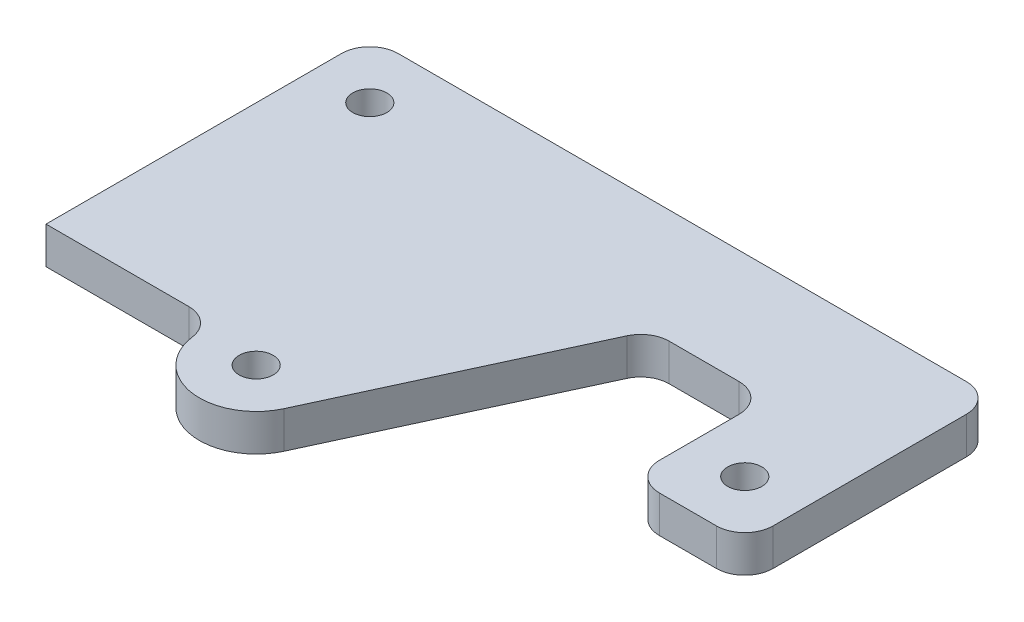
ISO-10303-21;
HEADER;
FILE_DESCRIPTION(('STEP AP214'),'2;1');
FILE_NAME('part.step','',(''),(''),'','','');
FILE_SCHEMA(('AUTOMOTIVE_DESIGN { 1 0 10303 214 1 1 1 1 }'));
ENDSEC;
DATA;
#1=APPLICATION_CONTEXT('core data for automotive mechanical design processes');
#2=APPLICATION_PROTOCOL_DEFINITION('international standard','automotive_design',2000,#1);
#3=PRODUCT_CONTEXT('',#1,'mechanical');
#4=PRODUCT('Part','Part','',(#3));
#5=PRODUCT_RELATED_PRODUCT_CATEGORY('part','',(#4));
#6=PRODUCT_DEFINITION_FORMATION('','',#4);
#7=PRODUCT_DEFINITION_CONTEXT('part definition',#1,'design');
#8=PRODUCT_DEFINITION('design','',#6,#7);
#9=PRODUCT_DEFINITION_SHAPE('','',#8);
#10=(LENGTH_UNIT() NAMED_UNIT(*) SI_UNIT(.MILLI.,.METRE.));
#11=(NAMED_UNIT(*) PLANE_ANGLE_UNIT() SI_UNIT($,.RADIAN.));
#12=(NAMED_UNIT(*) SI_UNIT($,.STERADIAN.) SOLID_ANGLE_UNIT());
#13=UNCERTAINTY_MEASURE_WITH_UNIT(LENGTH_MEASURE(1.E-05),#10,'distance_accuracy_value','');
#14=(GEOMETRIC_REPRESENTATION_CONTEXT(3) GLOBAL_UNCERTAINTY_ASSIGNED_CONTEXT((#13)) GLOBAL_UNIT_ASSIGNED_CONTEXT((#10,
#11,#12)) REPRESENTATION_CONTEXT('',''));
#15=CARTESIAN_POINT('',(0.,0.,0.));
#16=DIRECTION('',(0.,0.,1.));
#17=DIRECTION('',(1.,0.,0.));
#18=AXIS2_PLACEMENT_3D('',#15,#16,#17);
#19=CARTESIAN_POINT('',(25.1339312526815,6.5,5.));
#20=DIRECTION('',(0.,-1.,0.));
#21=DIRECTION('',(0.,0.,-1.));
#22=AXIS2_PLACEMENT_3D('',#19,#20,#21);
#23=PLANE('',#22);
#24=DIRECTION('',(1.,0.,0.));
#25=VECTOR('',#24,1.);
#26=CARTESIAN_POINT('',(0.,6.5,0.));
#27=LINE('',#26,#25);
#28=CARTESIAN_POINT('',(0.,6.5,0.));
#29=VERTEX_POINT('',#28);
#30=CARTESIAN_POINT('',(25.1339312526815,6.5,0.));
#31=VERTEX_POINT('',#30);
#32=EDGE_CURVE('E236',#29,#31,#27,.T.);
#33=ORIENTED_EDGE('',*,*,#32,.T.);
#34=CARTESIAN_POINT('',(25.1339312526815,6.5,5.));
#35=DIRECTION('',(0.,-1.,0.));
#36=DIRECTION('',(0.,0.,-1.));
#37=AXIS2_PLACEMENT_3D('',#34,#35,#36);
#38=CIRCLE('',#37,5.);
#39=CARTESIAN_POINT('',(30.0892875017877,6.5,4.33333333333333));
#40=VERTEX_POINT('',#39);
#41=EDGE_CURVE('E124',#31,#40,#38,.T.);
#42=ORIENTED_EDGE('',*,*,#41,.T.);
#43=CARTESIAN_POINT('',(40.,6.5,3.));
#44=DIRECTION('',(0.,1.,0.));
#45=DIRECTION('',(0.,0.,1.));
#46=AXIS2_PLACEMENT_3D('',#43,#44,#45);
#47=CIRCLE('',#46,10.);
#48=CARTESIAN_POINT('',(49.0779587270382,6.5,7.19412271520401));
#49=VERTEX_POINT('',#48);
#50=EDGE_CURVE('E289',#40,#49,#47,.T.);
#51=ORIENTED_EDGE('',*,*,#50,.T.);
#52=DIRECTION('',(0.419412271520401,0.,-0.907795872703824));
#53=VECTOR('',#52,1.);
#54=CARTESIAN_POINT('',(68.1549669251056,6.5,-34.097061357602));
#55=LINE('',#54,#53);
#56=CARTESIAN_POINT('',(68.1549669251056,6.5,-34.097061357602));
#57=VERTEX_POINT('',#56);
#58=EDGE_CURVE('E309',#49,#57,#55,.T.);
#59=ORIENTED_EDGE('',*,*,#58,.T.);
#60=CARTESIAN_POINT('',(72.6939462886247,6.5,-32.));
#61=DIRECTION('',(0.,-1.,0.));
#62=DIRECTION('',(0.,0.,1.));
#63=AXIS2_PLACEMENT_3D('',#60,#61,#62);
#64=CIRCLE('',#63,5.);
#65=CARTESIAN_POINT('',(72.6939462886247,6.5,-37.));
#66=VERTEX_POINT('',#65);
#67=EDGE_CURVE('E305',#57,#66,#64,.T.);
#68=ORIENTED_EDGE('',*,*,#67,.T.);
#69=DIRECTION('',(1.,0.,0.));
#70=VECTOR('',#69,1.);
#71=CARTESIAN_POINT('',(85.,6.5,-37.));
#72=LINE('',#71,#70);
#73=CARTESIAN_POINT('',(85.,6.5,-37.));
#74=VERTEX_POINT('',#73);
#75=EDGE_CURVE('E308',#66,#74,#72,.T.);
#76=ORIENTED_EDGE('',*,*,#75,.T.);
#77=CARTESIAN_POINT('',(85.,6.5,-32.));
#78=DIRECTION('',(0.,-1.,0.));
#79=DIRECTION('',(0.,0.,1.));
#80=AXIS2_PLACEMENT_3D('',#77,#78,#79);
#81=CIRCLE('',#80,5.);
#82=CARTESIAN_POINT('',(90.,6.5,-32.));
#83=VERTEX_POINT('',#82);
#84=EDGE_CURVE('E313',#74,#83,#81,.T.);
#85=ORIENTED_EDGE('',*,*,#84,.T.);
#86=DIRECTION('',(0.,0.,1.));
#87=VECTOR('',#86,1.);
#88=CARTESIAN_POINT('',(90.,6.5,-18.));
#89=LINE('',#88,#87);
#90=CARTESIAN_POINT('',(90.,6.5,-18.));
#91=VERTEX_POINT('',#90);
#92=EDGE_CURVE('E320',#83,#91,#89,.T.);
#93=ORIENTED_EDGE('',*,*,#92,.T.);
#94=CARTESIAN_POINT('',(95.,6.5,-18.));
#95=DIRECTION('',(0.,1.,0.));
#96=DIRECTION('',(0.,0.,-1.));
#97=AXIS2_PLACEMENT_3D('',#94,#95,#96);
#98=CIRCLE('',#97,5.);
#99=CARTESIAN_POINT('',(95.,6.5,-13.));
#100=VERTEX_POINT('',#99);
#101=EDGE_CURVE('E323',#91,#100,#98,.T.);
#102=ORIENTED_EDGE('',*,*,#101,.T.);
#103=DIRECTION('',(1.,0.,0.));
#104=VECTOR('',#103,1.);
#105=CARTESIAN_POINT('',(105.,6.5,-13.));
#106=LINE('',#105,#104);
#107=CARTESIAN_POINT('',(105.,6.5,-13.));
#108=VERTEX_POINT('',#107);
#109=EDGE_CURVE('E326',#100,#108,#106,.T.);
#110=ORIENTED_EDGE('',*,*,#109,.T.);
#111=CARTESIAN_POINT('',(105.,6.5,-18.));
#112=DIRECTION('',(0.,1.,0.));
#113=DIRECTION('',(0.,0.,-1.));
#114=AXIS2_PLACEMENT_3D('',#111,#112,#113);
#115=CIRCLE('',#114,5.);
#116=CARTESIAN_POINT('',(110.,6.5,-18.));
#117=VERTEX_POINT('',#116);
#118=EDGE_CURVE('E329',#108,#117,#115,.T.);
#119=ORIENTED_EDGE('',*,*,#118,.T.);
#120=DIRECTION('',(0.,0.,-1.));
#121=VECTOR('',#120,1.);
#122=CARTESIAN_POINT('',(110.,6.5,-52.));
#123=LINE('',#122,#121);
#124=CARTESIAN_POINT('',(110.,6.5,-52.));
#125=VERTEX_POINT('',#124);
#126=EDGE_CURVE('E332',#117,#125,#123,.T.);
#127=ORIENTED_EDGE('',*,*,#126,.T.);
#128=CARTESIAN_POINT('',(105.,6.5,-52.));
#129=DIRECTION('',(0.,1.,0.));
#130=DIRECTION('',(0.,0.,-1.));
#131=AXIS2_PLACEMENT_3D('',#128,#129,#130);
#132=CIRCLE('',#131,5.);
#133=CARTESIAN_POINT('',(105.,6.5,-57.));
#134=VERTEX_POINT('',#133);
#135=EDGE_CURVE('E167',#125,#134,#132,.T.);
#136=ORIENTED_EDGE('',*,*,#135,.T.);
#137=DIRECTION('',(-1.,0.,0.));
#138=VECTOR('',#137,1.);
#139=CARTESIAN_POINT('',(5.00000000000004,6.5,-57.));
#140=LINE('',#139,#138);
#141=CARTESIAN_POINT('',(5.,6.5,-57.));
#142=VERTEX_POINT('',#141);
#143=EDGE_CURVE('E161',#134,#142,#140,.T.);
#144=ORIENTED_EDGE('',*,*,#143,.T.);
#145=CARTESIAN_POINT('',(5.,6.5,-52.));
#146=DIRECTION('',(0.,1.,0.));
#147=DIRECTION('',(0.,0.,-1.));
#148=AXIS2_PLACEMENT_3D('',#145,#146,#147);
#149=CIRCLE('',#148,5.);
#150=CARTESIAN_POINT('',(0.,6.5,-52.));
#151=VERTEX_POINT('',#150);
#152=EDGE_CURVE('E165',#142,#151,#149,.T.);
#153=ORIENTED_EDGE('',*,*,#152,.T.);
#154=DIRECTION('',(0.,0.,1.));
#155=VECTOR('',#154,1.);
#156=CARTESIAN_POINT('',(0.,6.5,0.));
#157=LINE('',#156,#155);
#158=EDGE_CURVE('E57',#151,#29,#157,.T.);
#159=ORIENTED_EDGE('',*,*,#158,.T.);
#160=EDGE_LOOP('',(#33,#42,#51,#59,#68,#76,#85,#93,#102,#110,#119,#127,#136,#144,#153,#159));
#161=FACE_BOUND('',#160,.T.);
#162=CARTESIAN_POINT('',(10.,6.5,-47.));
#163=DIRECTION('',(0.,1.,0.));
#164=DIRECTION('',(0.,0.,1.));
#165=AXIS2_PLACEMENT_3D('',#162,#163,#164);
#166=CIRCLE('',#165,3.);
#167=CARTESIAN_POINT('',(10.,6.5,-50.));
#168=VERTEX_POINT('',#167);
#169=EDGE_CURVE('E194',#168,#168,#166,.T.);
#170=ORIENTED_EDGE('',*,*,#169,.F.);
#171=EDGE_LOOP('',(#170));
#172=FACE_BOUND('',#171,.T.);
#173=CARTESIAN_POINT('',(40.,6.5,3.));
#174=DIRECTION('',(0.,1.,0.));
#175=DIRECTION('',(0.,0.,1.));
#176=AXIS2_PLACEMENT_3D('',#173,#174,#175);
#177=CIRCLE('',#176,3.);
#178=CARTESIAN_POINT('',(40.,6.5,0.));
#179=VERTEX_POINT('',#178);
#180=EDGE_CURVE('E390',#179,#179,#177,.T.);
#181=ORIENTED_EDGE('',*,*,#180,.F.);
#182=EDGE_LOOP('',(#181));
#183=FACE_BOUND('',#182,.T.);
#184=CARTESIAN_POINT('',(100.,6.5,-23.));
#185=DIRECTION('',(0.,1.,0.));
#186=DIRECTION('',(0.,0.,1.));
#187=AXIS2_PLACEMENT_3D('',#184,#185,#186);
#188=CIRCLE('',#187,3.00000000000001);
#189=CARTESIAN_POINT('',(100.,6.5,-26.));
#190=VERTEX_POINT('',#189);
#191=EDGE_CURVE('E379',#190,#190,#188,.T.);
#192=ORIENTED_EDGE('',*,*,#191,.F.);
#193=EDGE_LOOP('',(#192));
#194=FACE_BOUND('',#193,.T.);
#195=ADVANCED_FACE('F39',(#161,#172,#183,#194),#23,.F.);
#196=CARTESIAN_POINT('',(25.1339312526815,0.,5.));
#197=DIRECTION('',(0.,-1.,0.));
#198=DIRECTION('',(0.,0.,-1.));
#199=AXIS2_PLACEMENT_3D('',#196,#197,#198);
#200=PLANE('',#199);
#201=CARTESIAN_POINT('',(40.,0.,3.));
#202=DIRECTION('',(0.,1.,0.));
#203=DIRECTION('',(0.,0.,1.));
#204=AXIS2_PLACEMENT_3D('',#201,#202,#203);
#205=CIRCLE('',#204,3.);
#206=CARTESIAN_POINT('',(40.,0.,0.));
#207=VERTEX_POINT('',#206);
#208=EDGE_CURVE('E387',#207,#207,#205,.T.);
#209=ORIENTED_EDGE('',*,*,#208,.T.);
#210=EDGE_LOOP('',(#209));
#211=FACE_BOUND('',#210,.T.);
#212=DIRECTION('',(1.,0.,0.));
#213=VECTOR('',#212,1.);
#214=CARTESIAN_POINT('',(0.,0.,0.));
#215=LINE('',#214,#213);
#216=CARTESIAN_POINT('',(0.,0.,0.));
#217=VERTEX_POINT('',#216);
#218=CARTESIAN_POINT('',(25.1339312526815,0.,0.));
#219=VERTEX_POINT('',#218);
#220=EDGE_CURVE('E189',#217,#219,#215,.T.);
#221=ORIENTED_EDGE('',*,*,#220,.F.);
#222=DIRECTION('',(0.,0.,1.));
#223=VECTOR('',#222,1.);
#224=CARTESIAN_POINT('',(0.,0.,0.));
#225=LINE('',#224,#223);
#226=CARTESIAN_POINT('',(0.,0.,-52.));
#227=VERTEX_POINT('',#226);
#228=EDGE_CURVE('E116',#227,#217,#225,.T.);
#229=ORIENTED_EDGE('',*,*,#228,.F.);
#230=CARTESIAN_POINT('',(5.,0.,-52.));
#231=DIRECTION('',(0.,1.,0.));
#232=DIRECTION('',(0.,0.,-1.));
#233=AXIS2_PLACEMENT_3D('',#230,#231,#232);
#234=CIRCLE('',#233,5.);
#235=CARTESIAN_POINT('',(5.,0.,-57.));
#236=VERTEX_POINT('',#235);
#237=EDGE_CURVE('E110',#236,#227,#234,.T.);
#238=ORIENTED_EDGE('',*,*,#237,.F.);
#239=DIRECTION('',(-1.,0.,0.));
#240=VECTOR('',#239,1.);
#241=CARTESIAN_POINT('',(5.00000000000004,0.,-57.));
#242=LINE('',#241,#240);
#243=CARTESIAN_POINT('',(105.,0.,-57.));
#244=VERTEX_POINT('',#243);
#245=EDGE_CURVE('E176',#244,#236,#242,.T.);
#246=ORIENTED_EDGE('',*,*,#245,.F.);
#247=CARTESIAN_POINT('',(105.,0.,-52.));
#248=DIRECTION('',(0.,1.,0.));
#249=DIRECTION('',(0.,0.,-1.));
#250=AXIS2_PLACEMENT_3D('',#247,#248,#249);
#251=CIRCLE('',#250,5.);
#252=CARTESIAN_POINT('',(110.,0.,-52.));
#253=VERTEX_POINT('',#252);
#254=EDGE_CURVE('E227',#253,#244,#251,.T.);
#255=ORIENTED_EDGE('',*,*,#254,.F.);
#256=DIRECTION('',(0.,0.,-1.));
#257=VECTOR('',#256,1.);
#258=CARTESIAN_POINT('',(110.,0.,-52.));
#259=LINE('',#258,#257);
#260=CARTESIAN_POINT('',(110.,0.,-18.));
#261=VERTEX_POINT('',#260);
#262=EDGE_CURVE('E224',#261,#253,#259,.T.);
#263=ORIENTED_EDGE('',*,*,#262,.F.);
#264=CARTESIAN_POINT('',(105.,0.,-18.));
#265=DIRECTION('',(0.,1.,0.));
#266=DIRECTION('',(0.,0.,-1.));
#267=AXIS2_PLACEMENT_3D('',#264,#265,#266);
#268=CIRCLE('',#267,5.);
#269=CARTESIAN_POINT('',(105.,0.,-13.));
#270=VERTEX_POINT('',#269);
#271=EDGE_CURVE('E221',#270,#261,#268,.T.);
#272=ORIENTED_EDGE('',*,*,#271,.F.);
#273=DIRECTION('',(1.,0.,0.));
#274=VECTOR('',#273,1.);
#275=CARTESIAN_POINT('',(105.,0.,-13.));
#276=LINE('',#275,#274);
#277=CARTESIAN_POINT('',(95.,0.,-13.));
#278=VERTEX_POINT('',#277);
#279=EDGE_CURVE('E218',#278,#270,#276,.T.);
#280=ORIENTED_EDGE('',*,*,#279,.F.);
#281=CARTESIAN_POINT('',(95.,0.,-18.));
#282=DIRECTION('',(0.,1.,0.));
#283=DIRECTION('',(0.,0.,-1.));
#284=AXIS2_PLACEMENT_3D('',#281,#282,#283);
#285=CIRCLE('',#284,5.);
#286=CARTESIAN_POINT('',(90.,0.,-18.));
#287=VERTEX_POINT('',#286);
#288=EDGE_CURVE('E215',#287,#278,#285,.T.);
#289=ORIENTED_EDGE('',*,*,#288,.F.);
#290=DIRECTION('',(0.,0.,1.));
#291=VECTOR('',#290,1.);
#292=CARTESIAN_POINT('',(90.,0.,-18.));
#293=LINE('',#292,#291);
#294=CARTESIAN_POINT('',(90.,0.,-32.));
#295=VERTEX_POINT('',#294);
#296=EDGE_CURVE('E212',#295,#287,#293,.T.);
#297=ORIENTED_EDGE('',*,*,#296,.F.);
#298=CARTESIAN_POINT('',(85.,0.,-32.));
#299=DIRECTION('',(0.,-1.,0.));
#300=DIRECTION('',(0.,0.,1.));
#301=AXIS2_PLACEMENT_3D('',#298,#299,#300);
#302=CIRCLE('',#301,5.);
#303=CARTESIAN_POINT('',(85.,0.,-37.));
#304=VERTEX_POINT('',#303);
#305=EDGE_CURVE('E209',#304,#295,#302,.T.);
#306=ORIENTED_EDGE('',*,*,#305,.F.);
#307=DIRECTION('',(1.,0.,0.));
#308=VECTOR('',#307,1.);
#309=CARTESIAN_POINT('',(85.,0.,-37.));
#310=LINE('',#309,#308);
#311=CARTESIAN_POINT('',(72.6939462886247,0.,-37.));
#312=VERTEX_POINT('',#311);
#313=EDGE_CURVE('E206',#312,#304,#310,.T.);
#314=ORIENTED_EDGE('',*,*,#313,.F.);
#315=CARTESIAN_POINT('',(72.6939462886247,0.,-32.));
#316=DIRECTION('',(0.,-1.,0.));
#317=DIRECTION('',(0.,0.,1.));
#318=AXIS2_PLACEMENT_3D('',#315,#316,#317);
#319=CIRCLE('',#318,5.);
#320=CARTESIAN_POINT('',(68.1549669251056,0.,-34.097061357602));
#321=VERTEX_POINT('',#320);
#322=EDGE_CURVE('E203',#321,#312,#319,.T.);
#323=ORIENTED_EDGE('',*,*,#322,.F.);
#324=DIRECTION('',(0.419412271520401,0.,-0.907795872703824));
#325=VECTOR('',#324,1.);
#326=CARTESIAN_POINT('',(68.1549669251056,0.,-34.097061357602));
#327=LINE('',#326,#325);
#328=CARTESIAN_POINT('',(49.0779587270382,0.,7.19412271520401));
#329=VERTEX_POINT('',#328);
#330=EDGE_CURVE('E200',#329,#321,#327,.T.);
#331=ORIENTED_EDGE('',*,*,#330,.F.);
#332=CARTESIAN_POINT('',(40.,0.,3.));
#333=DIRECTION('',(0.,1.,0.));
#334=DIRECTION('',(0.,0.,1.));
#335=AXIS2_PLACEMENT_3D('',#332,#333,#334);
#336=CIRCLE('',#335,10.);
#337=CARTESIAN_POINT('',(30.0892875017877,0.,4.33333333333333));
#338=VERTEX_POINT('',#337);
#339=EDGE_CURVE('E197',#338,#329,#336,.T.);
#340=ORIENTED_EDGE('',*,*,#339,.F.);
#341=CARTESIAN_POINT('',(25.1339312526815,0.,5.));
#342=DIRECTION('',(0.,-1.,0.));
#343=DIRECTION('',(0.,0.,-1.));
#344=AXIS2_PLACEMENT_3D('',#341,#342,#343);
#345=CIRCLE('',#344,5.);
#346=EDGE_CURVE('E193',#219,#338,#345,.T.);
#347=ORIENTED_EDGE('',*,*,#346,.F.);
#348=EDGE_LOOP('',(#221,#229,#238,#246,#255,#263,#272,#280,#289,#297,#306,#314,#323,#331,#340,#347));
#349=FACE_BOUND('',#348,.T.);
#350=CARTESIAN_POINT('',(10.,0.,-47.));
#351=DIRECTION('',(0.,1.,0.));
#352=DIRECTION('',(0.,0.,1.));
#353=AXIS2_PLACEMENT_3D('',#350,#351,#352);
#354=CIRCLE('',#353,3.);
#355=CARTESIAN_POINT('',(10.,0.,-50.));
#356=VERTEX_POINT('',#355);
#357=EDGE_CURVE('E394',#356,#356,#354,.T.);
#358=ORIENTED_EDGE('',*,*,#357,.T.);
#359=EDGE_LOOP('',(#358));
#360=FACE_BOUND('',#359,.T.);
#361=CARTESIAN_POINT('',(100.,0.,-23.));
#362=DIRECTION('',(0.,1.,0.));
#363=DIRECTION('',(0.,0.,1.));
#364=AXIS2_PLACEMENT_3D('',#361,#362,#363);
#365=CIRCLE('',#364,3.00000000000001);
#366=CARTESIAN_POINT('',(100.,0.,-26.));
#367=VERTEX_POINT('',#366);
#368=EDGE_CURVE('E382',#367,#367,#365,.T.);
#369=ORIENTED_EDGE('',*,*,#368,.T.);
#370=EDGE_LOOP('',(#369));
#371=FACE_BOUND('',#370,.T.);
#372=ADVANCED_FACE('F293',(#211,#349,#360,#371),#200,.T.);
#373=CARTESIAN_POINT('',(0.,6.5,0.));
#374=DIRECTION('',(0.,0.,-1.));
#375=DIRECTION('',(-1.,0.,0.));
#376=AXIS2_PLACEMENT_3D('',#373,#374,#375);
#377=PLANE('',#376);
#378=ORIENTED_EDGE('',*,*,#220,.T.);
#379=DIRECTION('',(0.,-1.,0.));
#380=VECTOR('',#379,1.);
#381=CARTESIAN_POINT('',(25.1339312526815,6.5,0.));
#382=LINE('',#381,#380);
#383=EDGE_CURVE('E11',#31,#219,#382,.T.);
#384=ORIENTED_EDGE('',*,*,#383,.F.);
#385=ORIENTED_EDGE('',*,*,#32,.F.);
#386=DIRECTION('',(0.,-1.,0.));
#387=VECTOR('',#386,1.);
#388=CARTESIAN_POINT('',(0.,6.5,0.));
#389=LINE('',#388,#387);
#390=EDGE_CURVE('E185',#29,#217,#389,.T.);
#391=ORIENTED_EDGE('',*,*,#390,.T.);
#392=EDGE_LOOP('',(#378,#384,#385,#391));
#393=FACE_BOUND('',#392,.T.);
#394=ADVANCED_FACE('F41',(#393),#377,.F.);
#395=CARTESIAN_POINT('',(25.1339312526815,6.5,5.));
#396=DIRECTION('',(0.,-1.,0.));
#397=DIRECTION('',(0.,0.,-1.));
#398=AXIS2_PLACEMENT_3D('',#395,#396,#397);
#399=CYLINDRICAL_SURFACE('',#398,5.);
#400=ORIENTED_EDGE('',*,*,#346,.T.);
#401=DIRECTION('',(0.,-1.,0.));
#402=VECTOR('',#401,1.);
#403=CARTESIAN_POINT('',(30.0892875017877,6.5,4.33333333333333));
#404=LINE('',#403,#402);
#405=EDGE_CURVE('E49',#40,#338,#404,.T.);
#406=ORIENTED_EDGE('',*,*,#405,.F.);
#407=ORIENTED_EDGE('',*,*,#41,.F.);
#408=ORIENTED_EDGE('',*,*,#383,.T.);
#409=EDGE_LOOP('',(#400,#406,#407,#408));
#410=FACE_BOUND('',#409,.T.);
#411=ADVANCED_FACE('F543',(#410),#399,.F.);
#412=CARTESIAN_POINT('',(40.,6.5,3.));
#413=DIRECTION('',(0.,-1.,0.));
#414=DIRECTION('',(0.,0.,-1.));
#415=AXIS2_PLACEMENT_3D('',#412,#413,#414);
#416=CYLINDRICAL_SURFACE('',#415,10.);
#417=ORIENTED_EDGE('',*,*,#339,.T.);
#418=DIRECTION('',(0.,-1.,0.));
#419=VECTOR('',#418,1.);
#420=CARTESIAN_POINT('',(49.0779587270382,6.5,7.19412271520401));
#421=LINE('',#420,#419);
#422=EDGE_CURVE('E279',#49,#329,#421,.T.);
#423=ORIENTED_EDGE('',*,*,#422,.F.);
#424=ORIENTED_EDGE('',*,*,#50,.F.);
#425=ORIENTED_EDGE('',*,*,#405,.T.);
#426=EDGE_LOOP('',(#417,#423,#424,#425));
#427=FACE_BOUND('',#426,.T.);
#428=ADVANCED_FACE('F287',(#427),#416,.T.);
#429=CARTESIAN_POINT('',(68.1549669251056,6.5,-34.097061357602));
#430=DIRECTION('',(-0.907795872703824,0.,-0.419412271520401));
#431=DIRECTION('',(-0.419412271520401,0.,0.907795872703824));
#432=AXIS2_PLACEMENT_3D('',#429,#430,#431);
#433=PLANE('',#432);
#434=ORIENTED_EDGE('',*,*,#330,.T.);
#435=DIRECTION('',(0.,-1.,0.));
#436=VECTOR('',#435,1.);
#437=CARTESIAN_POINT('',(68.1549669251056,6.5,-34.097061357602));
#438=LINE('',#437,#436);
#439=EDGE_CURVE('E275',#57,#321,#438,.T.);
#440=ORIENTED_EDGE('',*,*,#439,.F.);
#441=ORIENTED_EDGE('',*,*,#58,.F.);
#442=ORIENTED_EDGE('',*,*,#422,.T.);
#443=EDGE_LOOP('',(#434,#440,#441,#442));
#444=FACE_BOUND('',#443,.T.);
#445=ADVANCED_FACE('F299',(#444),#433,.F.);
#446=CARTESIAN_POINT('',(72.6939462886247,6.5,-32.));
#447=DIRECTION('',(0.,-1.,0.));
#448=DIRECTION('',(0.,0.,-1.));
#449=AXIS2_PLACEMENT_3D('',#446,#447,#448);
#450=CYLINDRICAL_SURFACE('',#449,5.);
#451=ORIENTED_EDGE('',*,*,#322,.T.);
#452=DIRECTION('',(0.,-1.,0.));
#453=VECTOR('',#452,1.);
#454=CARTESIAN_POINT('',(72.6939462886247,6.5,-37.));
#455=LINE('',#454,#453);
#456=EDGE_CURVE('E271',#66,#312,#455,.T.);
#457=ORIENTED_EDGE('',*,*,#456,.F.);
#458=ORIENTED_EDGE('',*,*,#67,.F.);
#459=ORIENTED_EDGE('',*,*,#439,.T.);
#460=EDGE_LOOP('',(#451,#457,#458,#459));
#461=FACE_BOUND('',#460,.T.);
#462=ADVANCED_FACE('F303',(#461),#450,.F.);
#463=CARTESIAN_POINT('',(85.,6.5,-37.));
#464=DIRECTION('',(0.,0.,-1.));
#465=DIRECTION('',(-1.,0.,0.));
#466=AXIS2_PLACEMENT_3D('',#463,#464,#465);
#467=PLANE('',#466);
#468=ORIENTED_EDGE('',*,*,#313,.T.);
#469=DIRECTION('',(0.,-1.,0.));
#470=VECTOR('',#469,1.);
#471=CARTESIAN_POINT('',(85.,6.5,-37.));
#472=LINE('',#471,#470);
#473=EDGE_CURVE('E267',#74,#304,#472,.T.);
#474=ORIENTED_EDGE('',*,*,#473,.F.);
#475=ORIENTED_EDGE('',*,*,#75,.F.);
#476=ORIENTED_EDGE('',*,*,#456,.T.);
#477=EDGE_LOOP('',(#468,#474,#475,#476));
#478=FACE_BOUND('',#477,.T.);
#479=ADVANCED_FACE('F508',(#478),#467,.F.);
#480=CARTESIAN_POINT('',(85.,6.5,-32.));
#481=DIRECTION('',(0.,-1.,0.));
#482=DIRECTION('',(0.,0.,-1.));
#483=AXIS2_PLACEMENT_3D('',#480,#481,#482);
#484=CYLINDRICAL_SURFACE('',#483,5.);
#485=ORIENTED_EDGE('',*,*,#305,.T.);
#486=DIRECTION('',(0.,-1.,0.));
#487=VECTOR('',#486,1.);
#488=CARTESIAN_POINT('',(90.,6.5,-32.));
#489=LINE('',#488,#487);
#490=EDGE_CURVE('E263',#83,#295,#489,.T.);
#491=ORIENTED_EDGE('',*,*,#490,.F.);
#492=ORIENTED_EDGE('',*,*,#84,.F.);
#493=ORIENTED_EDGE('',*,*,#473,.T.);
#494=EDGE_LOOP('',(#485,#491,#492,#493));
#495=FACE_BOUND('',#494,.T.);
#496=ADVANCED_FACE('F498',(#495),#484,.F.);
#497=CARTESIAN_POINT('',(90.,6.5,-18.));
#498=DIRECTION('',(1.,0.,0.));
#499=DIRECTION('',(0.,0.,-1.));
#500=AXIS2_PLACEMENT_3D('',#497,#498,#499);
#501=PLANE('',#500);
#502=ORIENTED_EDGE('',*,*,#296,.T.);
#503=DIRECTION('',(0.,-1.,0.));
#504=VECTOR('',#503,1.);
#505=CARTESIAN_POINT('',(90.,6.5,-18.));
#506=LINE('',#505,#504);
#507=EDGE_CURVE('E259',#91,#287,#506,.T.);
#508=ORIENTED_EDGE('',*,*,#507,.F.);
#509=ORIENTED_EDGE('',*,*,#92,.F.);
#510=ORIENTED_EDGE('',*,*,#490,.T.);
#511=EDGE_LOOP('',(#502,#508,#509,#510));
#512=FACE_BOUND('',#511,.T.);
#513=ADVANCED_FACE('F488',(#512),#501,.F.);
#514=CARTESIAN_POINT('',(95.,6.5,-18.));
#515=DIRECTION('',(0.,-1.,0.));
#516=DIRECTION('',(0.,0.,-1.));
#517=AXIS2_PLACEMENT_3D('',#514,#515,#516);
#518=CYLINDRICAL_SURFACE('',#517,5.);
#519=ORIENTED_EDGE('',*,*,#288,.T.);
#520=DIRECTION('',(0.,-1.,0.));
#521=VECTOR('',#520,1.);
#522=CARTESIAN_POINT('',(95.,6.5,-13.));
#523=LINE('',#522,#521);
#524=EDGE_CURVE('E255',#100,#278,#523,.T.);
#525=ORIENTED_EDGE('',*,*,#524,.F.);
#526=ORIENTED_EDGE('',*,*,#101,.F.);
#527=ORIENTED_EDGE('',*,*,#507,.T.);
#528=EDGE_LOOP('',(#519,#525,#526,#527));
#529=FACE_BOUND('',#528,.T.);
#530=ADVANCED_FACE('F478',(#529),#518,.T.);
#531=CARTESIAN_POINT('',(105.,6.5,-13.));
#532=DIRECTION('',(0.,0.,-1.));
#533=DIRECTION('',(-1.,0.,0.));
#534=AXIS2_PLACEMENT_3D('',#531,#532,#533);
#535=PLANE('',#534);
#536=ORIENTED_EDGE('',*,*,#279,.T.);
#537=DIRECTION('',(0.,-1.,0.));
#538=VECTOR('',#537,1.);
#539=CARTESIAN_POINT('',(105.,6.5,-13.));
#540=LINE('',#539,#538);
#541=EDGE_CURVE('E251',#108,#270,#540,.T.);
#542=ORIENTED_EDGE('',*,*,#541,.F.);
#543=ORIENTED_EDGE('',*,*,#109,.F.);
#544=ORIENTED_EDGE('',*,*,#524,.T.);
#545=EDGE_LOOP('',(#536,#542,#543,#544));
#546=FACE_BOUND('',#545,.T.);
#547=ADVANCED_FACE('F468',(#546),#535,.F.);
#548=CARTESIAN_POINT('',(105.,6.5,-18.));
#549=DIRECTION('',(0.,-1.,0.));
#550=DIRECTION('',(0.,0.,-1.));
#551=AXIS2_PLACEMENT_3D('',#548,#549,#550);
#552=CYLINDRICAL_SURFACE('',#551,5.);
#553=ORIENTED_EDGE('',*,*,#271,.T.);
#554=DIRECTION('',(0.,-1.,0.));
#555=VECTOR('',#554,1.);
#556=CARTESIAN_POINT('',(110.,6.5,-18.));
#557=LINE('',#556,#555);
#558=EDGE_CURVE('E247',#117,#261,#557,.T.);
#559=ORIENTED_EDGE('',*,*,#558,.F.);
#560=ORIENTED_EDGE('',*,*,#118,.F.);
#561=ORIENTED_EDGE('',*,*,#541,.T.);
#562=EDGE_LOOP('',(#553,#559,#560,#561));
#563=FACE_BOUND('',#562,.T.);
#564=ADVANCED_FACE('F459',(#563),#552,.T.);
#565=CARTESIAN_POINT('',(110.,6.5,-52.));
#566=DIRECTION('',(-1.,0.,0.));
#567=DIRECTION('',(0.,0.,1.));
#568=AXIS2_PLACEMENT_3D('',#565,#566,#567);
#569=PLANE('',#568);
#570=ORIENTED_EDGE('',*,*,#262,.T.);
#571=DIRECTION('',(0.,-1.,0.));
#572=VECTOR('',#571,1.);
#573=CARTESIAN_POINT('',(110.,6.5,-52.));
#574=LINE('',#573,#572);
#575=EDGE_CURVE('E243',#125,#253,#574,.T.);
#576=ORIENTED_EDGE('',*,*,#575,.F.);
#577=ORIENTED_EDGE('',*,*,#126,.F.);
#578=ORIENTED_EDGE('',*,*,#558,.T.);
#579=EDGE_LOOP('',(#570,#576,#577,#578));
#580=FACE_BOUND('',#579,.T.);
#581=ADVANCED_FACE('F340',(#580),#569,.F.);
#582=CARTESIAN_POINT('',(105.,6.5,-52.));
#583=DIRECTION('',(0.,-1.,0.));
#584=DIRECTION('',(0.,0.,-1.));
#585=AXIS2_PLACEMENT_3D('',#582,#583,#584);
#586=CYLINDRICAL_SURFACE('',#585,5.);
#587=ORIENTED_EDGE('',*,*,#254,.T.);
#588=DIRECTION('',(0.,-1.,0.));
#589=VECTOR('',#588,1.);
#590=CARTESIAN_POINT('',(105.,6.5,-57.));
#591=LINE('',#590,#589);
#592=EDGE_CURVE('E178',#134,#244,#591,.T.);
#593=ORIENTED_EDGE('',*,*,#592,.F.);
#594=ORIENTED_EDGE('',*,*,#135,.F.);
#595=ORIENTED_EDGE('',*,*,#575,.T.);
#596=EDGE_LOOP('',(#587,#593,#594,#595));
#597=FACE_BOUND('',#596,.T.);
#598=ADVANCED_FACE('F344',(#597),#586,.T.);
#599=CARTESIAN_POINT('',(5.00000000000004,6.5,-57.));
#600=DIRECTION('',(0.,0.,1.));
#601=DIRECTION('',(1.,0.,0.));
#602=AXIS2_PLACEMENT_3D('',#599,#600,#601);
#603=PLANE('',#602);
#604=ORIENTED_EDGE('',*,*,#245,.T.);
#605=DIRECTION('',(0.,-1.,0.));
#606=VECTOR('',#605,1.);
#607=CARTESIAN_POINT('',(5.,6.5,-57.));
#608=LINE('',#607,#606);
#609=EDGE_CURVE('E173',#142,#236,#608,.T.);
#610=ORIENTED_EDGE('',*,*,#609,.F.);
#611=ORIENTED_EDGE('',*,*,#143,.F.);
#612=ORIENTED_EDGE('',*,*,#592,.T.);
#613=EDGE_LOOP('',(#604,#610,#611,#612));
#614=FACE_BOUND('',#613,.T.);
#615=ADVANCED_FACE('F174',(#614),#603,.F.);
#616=CARTESIAN_POINT('',(5.,6.5,-52.));
#617=DIRECTION('',(0.,-1.,0.));
#618=DIRECTION('',(0.,0.,-1.));
#619=AXIS2_PLACEMENT_3D('',#616,#617,#618);
#620=CYLINDRICAL_SURFACE('',#619,5.);
#621=ORIENTED_EDGE('',*,*,#237,.T.);
#622=DIRECTION('',(0.,-1.,0.));
#623=VECTOR('',#622,1.);
#624=CARTESIAN_POINT('',(0.,6.5,-52.));
#625=LINE('',#624,#623);
#626=EDGE_CURVE('E179',#151,#227,#625,.T.);
#627=ORIENTED_EDGE('',*,*,#626,.F.);
#628=ORIENTED_EDGE('',*,*,#152,.F.);
#629=ORIENTED_EDGE('',*,*,#609,.T.);
#630=EDGE_LOOP('',(#621,#627,#628,#629));
#631=FACE_BOUND('',#630,.T.);
#632=ADVANCED_FACE('F181',(#631),#620,.T.);
#633=CARTESIAN_POINT('',(0.,6.5,0.));
#634=DIRECTION('',(1.,0.,0.));
#635=DIRECTION('',(0.,0.,-1.));
#636=AXIS2_PLACEMENT_3D('',#633,#634,#635);
#637=PLANE('',#636);
#638=ORIENTED_EDGE('',*,*,#228,.T.);
#639=ORIENTED_EDGE('',*,*,#390,.F.);
#640=ORIENTED_EDGE('',*,*,#158,.F.);
#641=ORIENTED_EDGE('',*,*,#626,.T.);
#642=EDGE_LOOP('',(#638,#639,#640,#641));
#643=FACE_BOUND('',#642,.T.);
#644=ADVANCED_FACE('F348',(#643),#637,.F.);
#645=CARTESIAN_POINT('',(10.,6.5,-47.));
#646=DIRECTION('',(0.,-1.,0.));
#647=DIRECTION('',(0.,0.,-1.));
#648=AXIS2_PLACEMENT_3D('',#645,#646,#647);
#649=CYLINDRICAL_SURFACE('',#648,3.);
#650=CARTESIAN_POINT('',(10.,6.5,-50.));
#651=CARTESIAN_POINT('',(10.,6.43229166666667,-50.));
#652=CARTESIAN_POINT('',(10.,6.36458333333333,-50.));
#653=CARTESIAN_POINT('',(10.,6.22916666666667,-50.));
#654=CARTESIAN_POINT('',(10.,6.16145833333333,-50.));
#655=CARTESIAN_POINT('',(10.,6.02604166666667,-50.));
#656=CARTESIAN_POINT('',(10.,5.95833333333333,-50.));
#657=CARTESIAN_POINT('',(10.,5.82291666666667,-50.));
#658=CARTESIAN_POINT('',(10.,5.75520833333333,-50.));
#659=CARTESIAN_POINT('',(10.,5.61979166666667,-50.));
#660=CARTESIAN_POINT('',(10.,5.55208333333333,-50.));
#661=CARTESIAN_POINT('',(10.,5.41666666666667,-50.));
#662=CARTESIAN_POINT('',(10.,5.34895833333333,-50.));
#663=CARTESIAN_POINT('',(10.,5.21354166666667,-50.));
#664=CARTESIAN_POINT('',(10.,5.14583333333333,-50.));
#665=CARTESIAN_POINT('',(10.,5.01041666666667,-50.));
#666=CARTESIAN_POINT('',(10.,4.94270833333333,-50.));
#667=CARTESIAN_POINT('',(10.,4.80729166666667,-50.));
#668=CARTESIAN_POINT('',(10.,4.73958333333333,-50.));
#669=CARTESIAN_POINT('',(10.,4.60416666666667,-50.));
#670=CARTESIAN_POINT('',(10.,4.53645833333333,-50.));
#671=CARTESIAN_POINT('',(10.,4.40104166666667,-50.));
#672=CARTESIAN_POINT('',(10.,4.33333333333333,-50.));
#673=CARTESIAN_POINT('',(10.,4.19791666666667,-50.));
#674=CARTESIAN_POINT('',(10.,4.13020833333333,-50.));
#675=CARTESIAN_POINT('',(10.,3.99479166666667,-50.));
#676=CARTESIAN_POINT('',(10.,3.92708333333333,-50.));
#677=CARTESIAN_POINT('',(10.,3.79166666666667,-50.));
#678=CARTESIAN_POINT('',(10.,3.72395833333333,-50.));
#679=CARTESIAN_POINT('',(10.,3.58854166666667,-50.));
#680=CARTESIAN_POINT('',(10.,3.52083333333333,-50.));
#681=CARTESIAN_POINT('',(10.,3.38541666666667,-50.));
#682=CARTESIAN_POINT('',(10.,3.31770833333333,-50.));
#683=CARTESIAN_POINT('',(10.,3.18229166666667,-50.));
#684=CARTESIAN_POINT('',(10.,3.11458333333333,-50.));
#685=CARTESIAN_POINT('',(10.,2.97916666666667,-50.));
#686=CARTESIAN_POINT('',(10.,2.91145833333333,-50.));
#687=CARTESIAN_POINT('',(10.,2.77604166666667,-50.));
#688=CARTESIAN_POINT('',(10.,2.70833333333333,-50.));
#689=CARTESIAN_POINT('',(10.,2.57291666666667,-50.));
#690=CARTESIAN_POINT('',(10.,2.50520833333333,-50.));
#691=CARTESIAN_POINT('',(10.,2.36979166666667,-50.));
#692=CARTESIAN_POINT('',(10.,2.30208333333333,-50.));
#693=CARTESIAN_POINT('',(10.,2.16666666666667,-50.));
#694=CARTESIAN_POINT('',(10.,2.09895833333333,-50.));
#695=CARTESIAN_POINT('',(10.,1.96354166666667,-50.));
#696=CARTESIAN_POINT('',(10.,1.89583333333333,-50.));
#697=CARTESIAN_POINT('',(10.,1.76041666666667,-50.));
#698=CARTESIAN_POINT('',(10.,1.69270833333333,-50.));
#699=CARTESIAN_POINT('',(10.,1.55729166666667,-50.));
#700=CARTESIAN_POINT('',(10.,1.48958333333333,-50.));
#701=CARTESIAN_POINT('',(10.,1.35416666666667,-50.));
#702=CARTESIAN_POINT('',(10.,1.28645833333333,-50.));
#703=CARTESIAN_POINT('',(10.,1.15104166666667,-50.));
#704=CARTESIAN_POINT('',(10.,1.08333333333333,-50.));
#705=CARTESIAN_POINT('',(10.,0.947916666666667,-50.));
#706=CARTESIAN_POINT('',(10.,0.880208333333333,-50.));
#707=CARTESIAN_POINT('',(10.,0.744791666666667,-50.));
#708=CARTESIAN_POINT('',(10.,0.677083333333333,-50.));
#709=CARTESIAN_POINT('',(10.,0.541666666666667,-50.));
#710=CARTESIAN_POINT('',(10.,0.473958333333333,-50.));
#711=CARTESIAN_POINT('',(10.,0.338541666666667,-50.));
#712=CARTESIAN_POINT('',(10.,0.270833333333334,-50.));
#713=CARTESIAN_POINT('',(10.,0.135416666666667,-50.));
#714=CARTESIAN_POINT('',(10.,0.0677083333333334,-50.));
#715=CARTESIAN_POINT('',(10.,0.,-50.));
#716=B_SPLINE_CURVE_WITH_KNOTS('',3,(#650,#651,#652,#653,#654,#655,#656,#657,#658,#659,#660,
#661,#662,#663,#664,#665,#666,#667,#668,#669,#670,#671,#672,#673,#674,#675,#676,#677,#678,#679,
#680,#681,#682,#683,#684,#685,#686,#687,#688,#689,#690,#691,#692,#693,#694,#695,#696,#697,#698,
#699,#700,#701,#702,#703,#704,#705,#706,#707,#708,#709,#710,#711,#712,#713,#714,#715),
.UNSPECIFIED.,.F.,.F.,(4,2,2,2,2,2,2,2,2,2,2,2,2,2,2,2,2,2,2,2,2,2,2,2,2,2,2,2,2,2,2,2,4),(0.,
0.203125,0.40625,0.609375000000001,0.812500000000001,1.015625,1.21875,1.421875,1.625,1.828125,
2.03125,2.234375,2.4375,2.640625,2.84375,3.046875,3.25,3.453125,3.65625,3.859375,4.0625,
4.265625,4.46875,4.671875,4.875,5.078125,5.28125,5.484375,5.6875,5.890625,6.09375,6.296875,6.5),.UNSPECIFIED.);
#717=EDGE_CURVE('BSEAM350',#168,#356,#716,.T.);
#718=ORIENTED_EDGE('',*,*,#169,.T.);
#719=ORIENTED_EDGE('',*,*,#357,.F.);
#720=ORIENTED_EDGE('',*,*,#717,.T.);
#721=ORIENTED_EDGE('',*,*,#717,.F.);
#722=EDGE_LOOP('',(#718,#720,#719,#721));
#723=FACE_BOUND('',#722,.T.);
#724=ADVANCED_FACE('F350',(#723),#649,.F.);
#725=CARTESIAN_POINT('',(40.,6.5,3.));
#726=DIRECTION('',(0.,-1.,0.));
#727=DIRECTION('',(0.,0.,-1.));
#728=AXIS2_PLACEMENT_3D('',#725,#726,#727);
#729=CYLINDRICAL_SURFACE('',#728,3.);
#730=CARTESIAN_POINT('',(40.,6.5,0.));
#731=CARTESIAN_POINT('',(40.,6.43229166666667,0.));
#732=CARTESIAN_POINT('',(40.,6.36458333333333,0.));
#733=CARTESIAN_POINT('',(40.,6.22916666666667,0.));
#734=CARTESIAN_POINT('',(40.,6.16145833333333,0.));
#735=CARTESIAN_POINT('',(40.,6.02604166666667,0.));
#736=CARTESIAN_POINT('',(40.,5.95833333333333,0.));
#737=CARTESIAN_POINT('',(40.,5.82291666666667,0.));
#738=CARTESIAN_POINT('',(40.,5.75520833333333,0.));
#739=CARTESIAN_POINT('',(40.,5.61979166666667,0.));
#740=CARTESIAN_POINT('',(40.,5.55208333333333,0.));
#741=CARTESIAN_POINT('',(40.,5.41666666666667,0.));
#742=CARTESIAN_POINT('',(40.,5.34895833333333,0.));
#743=CARTESIAN_POINT('',(40.,5.21354166666667,0.));
#744=CARTESIAN_POINT('',(40.,5.14583333333333,0.));
#745=CARTESIAN_POINT('',(40.,5.01041666666667,0.));
#746=CARTESIAN_POINT('',(40.,4.94270833333333,0.));
#747=CARTESIAN_POINT('',(40.,4.80729166666667,0.));
#748=CARTESIAN_POINT('',(40.,4.73958333333333,0.));
#749=CARTESIAN_POINT('',(40.,4.60416666666667,0.));
#750=CARTESIAN_POINT('',(40.,4.53645833333333,0.));
#751=CARTESIAN_POINT('',(40.,4.40104166666667,0.));
#752=CARTESIAN_POINT('',(40.,4.33333333333333,0.));
#753=CARTESIAN_POINT('',(40.,4.19791666666667,0.));
#754=CARTESIAN_POINT('',(40.,4.13020833333333,0.));
#755=CARTESIAN_POINT('',(40.,3.99479166666667,0.));
#756=CARTESIAN_POINT('',(40.,3.92708333333333,0.));
#757=CARTESIAN_POINT('',(40.,3.79166666666667,0.));
#758=CARTESIAN_POINT('',(40.,3.72395833333333,0.));
#759=CARTESIAN_POINT('',(40.,3.58854166666667,0.));
#760=CARTESIAN_POINT('',(40.,3.52083333333333,0.));
#761=CARTESIAN_POINT('',(40.,3.38541666666667,0.));
#762=CARTESIAN_POINT('',(40.,3.31770833333333,0.));
#763=CARTESIAN_POINT('',(40.,3.18229166666667,0.));
#764=CARTESIAN_POINT('',(40.,3.11458333333333,0.));
#765=CARTESIAN_POINT('',(40.,2.97916666666667,0.));
#766=CARTESIAN_POINT('',(40.,2.91145833333333,0.));
#767=CARTESIAN_POINT('',(40.,2.77604166666667,0.));
#768=CARTESIAN_POINT('',(40.,2.70833333333333,0.));
#769=CARTESIAN_POINT('',(40.,2.57291666666667,0.));
#770=CARTESIAN_POINT('',(40.,2.50520833333333,0.));
#771=CARTESIAN_POINT('',(40.,2.36979166666667,0.));
#772=CARTESIAN_POINT('',(40.,2.30208333333333,0.));
#773=CARTESIAN_POINT('',(40.,2.16666666666667,0.));
#774=CARTESIAN_POINT('',(40.,2.09895833333333,0.));
#775=CARTESIAN_POINT('',(40.,1.96354166666667,0.));
#776=CARTESIAN_POINT('',(40.,1.89583333333333,0.));
#777=CARTESIAN_POINT('',(40.,1.76041666666667,0.));
#778=CARTESIAN_POINT('',(40.,1.69270833333333,0.));
#779=CARTESIAN_POINT('',(40.,1.55729166666667,0.));
#780=CARTESIAN_POINT('',(40.,1.48958333333333,0.));
#781=CARTESIAN_POINT('',(40.,1.35416666666667,0.));
#782=CARTESIAN_POINT('',(40.,1.28645833333333,0.));
#783=CARTESIAN_POINT('',(40.,1.15104166666667,0.));
#784=CARTESIAN_POINT('',(40.,1.08333333333333,0.));
#785=CARTESIAN_POINT('',(40.,0.947916666666667,0.));
#786=CARTESIAN_POINT('',(40.,0.880208333333333,0.));
#787=CARTESIAN_POINT('',(40.,0.744791666666667,0.));
#788=CARTESIAN_POINT('',(40.,0.677083333333333,0.));
#789=CARTESIAN_POINT('',(40.,0.541666666666667,0.));
#790=CARTESIAN_POINT('',(40.,0.473958333333333,0.));
#791=CARTESIAN_POINT('',(40.,0.338541666666667,0.));
#792=CARTESIAN_POINT('',(40.,0.270833333333334,0.));
#793=CARTESIAN_POINT('',(40.,0.135416666666667,0.));
#794=CARTESIAN_POINT('',(40.,0.0677083333333334,0.));
#795=CARTESIAN_POINT('',(40.,0.,0.));
#796=B_SPLINE_CURVE_WITH_KNOTS('',3,(#730,#731,#732,#733,#734,#735,#736,#737,#738,#739,#740,
#741,#742,#743,#744,#745,#746,#747,#748,#749,#750,#751,#752,#753,#754,#755,#756,#757,#758,#759,
#760,#761,#762,#763,#764,#765,#766,#767,#768,#769,#770,#771,#772,#773,#774,#775,#776,#777,#778,
#779,#780,#781,#782,#783,#784,#785,#786,#787,#788,#789,#790,#791,#792,#793,#794,#795),
.UNSPECIFIED.,.F.,.F.,(4,2,2,2,2,2,2,2,2,2,2,2,2,2,2,2,2,2,2,2,2,2,2,2,2,2,2,2,2,2,2,2,4),(0.,
0.203125,0.40625,0.609375000000001,0.812500000000001,1.015625,1.21875,1.421875,1.625,1.828125,
2.03125,2.234375,2.4375,2.640625,2.84375,3.046875,3.25,3.453125,3.65625,3.859375,4.0625,
4.265625,4.46875,4.671875,4.875,5.078125,5.28125,5.484375,5.6875,5.890625,6.09375,6.296875,6.5),.UNSPECIFIED.);
#797=EDGE_CURVE('BSEAM356',#179,#207,#796,.T.);
#798=ORIENTED_EDGE('',*,*,#180,.T.);
#799=ORIENTED_EDGE('',*,*,#208,.F.);
#800=ORIENTED_EDGE('',*,*,#797,.T.);
#801=ORIENTED_EDGE('',*,*,#797,.F.);
#802=EDGE_LOOP('',(#798,#800,#799,#801));
#803=FACE_BOUND('',#802,.T.);
#804=ADVANCED_FACE('F356',(#803),#729,.F.);
#805=CARTESIAN_POINT('',(100.,6.5,-23.));
#806=DIRECTION('',(0.,-1.,0.));
#807=DIRECTION('',(0.,0.,-1.));
#808=AXIS2_PLACEMENT_3D('',#805,#806,#807);
#809=CYLINDRICAL_SURFACE('',#808,3.00000000000001);
#810=CARTESIAN_POINT('',(100.,6.5,-26.));
#811=CARTESIAN_POINT('',(100.,6.43229166666667,-26.));
#812=CARTESIAN_POINT('',(100.,6.36458333333333,-26.));
#813=CARTESIAN_POINT('',(100.,6.22916666666667,-26.));
#814=CARTESIAN_POINT('',(100.,6.16145833333333,-26.));
#815=CARTESIAN_POINT('',(100.,6.02604166666667,-26.));
#816=CARTESIAN_POINT('',(100.,5.95833333333333,-26.));
#817=CARTESIAN_POINT('',(100.,5.82291666666667,-26.));
#818=CARTESIAN_POINT('',(100.,5.75520833333333,-26.));
#819=CARTESIAN_POINT('',(100.,5.61979166666667,-26.));
#820=CARTESIAN_POINT('',(100.,5.55208333333333,-26.));
#821=CARTESIAN_POINT('',(100.,5.41666666666667,-26.));
#822=CARTESIAN_POINT('',(100.,5.34895833333333,-26.));
#823=CARTESIAN_POINT('',(100.,5.21354166666667,-26.));
#824=CARTESIAN_POINT('',(100.,5.14583333333333,-26.));
#825=CARTESIAN_POINT('',(100.,5.01041666666667,-26.));
#826=CARTESIAN_POINT('',(100.,4.94270833333333,-26.));
#827=CARTESIAN_POINT('',(100.,4.80729166666667,-26.));
#828=CARTESIAN_POINT('',(100.,4.73958333333333,-26.));
#829=CARTESIAN_POINT('',(100.,4.60416666666667,-26.));
#830=CARTESIAN_POINT('',(100.,4.53645833333333,-26.));
#831=CARTESIAN_POINT('',(100.,4.40104166666667,-26.));
#832=CARTESIAN_POINT('',(100.,4.33333333333333,-26.));
#833=CARTESIAN_POINT('',(100.,4.19791666666667,-26.));
#834=CARTESIAN_POINT('',(100.,4.13020833333333,-26.));
#835=CARTESIAN_POINT('',(100.,3.99479166666667,-26.));
#836=CARTESIAN_POINT('',(100.,3.92708333333333,-26.));
#837=CARTESIAN_POINT('',(100.,3.79166666666667,-26.));
#838=CARTESIAN_POINT('',(100.,3.72395833333333,-26.));
#839=CARTESIAN_POINT('',(100.,3.58854166666667,-26.));
#840=CARTESIAN_POINT('',(100.,3.52083333333333,-26.));
#841=CARTESIAN_POINT('',(100.,3.38541666666667,-26.));
#842=CARTESIAN_POINT('',(100.,3.31770833333333,-26.));
#843=CARTESIAN_POINT('',(100.,3.18229166666667,-26.));
#844=CARTESIAN_POINT('',(100.,3.11458333333333,-26.));
#845=CARTESIAN_POINT('',(100.,2.97916666666667,-26.));
#846=CARTESIAN_POINT('',(100.,2.91145833333333,-26.));
#847=CARTESIAN_POINT('',(100.,2.77604166666667,-26.));
#848=CARTESIAN_POINT('',(100.,2.70833333333333,-26.));
#849=CARTESIAN_POINT('',(100.,2.57291666666667,-26.));
#850=CARTESIAN_POINT('',(100.,2.50520833333333,-26.));
#851=CARTESIAN_POINT('',(100.,2.36979166666667,-26.));
#852=CARTESIAN_POINT('',(100.,2.30208333333333,-26.));
#853=CARTESIAN_POINT('',(100.,2.16666666666667,-26.));
#854=CARTESIAN_POINT('',(100.,2.09895833333333,-26.));
#855=CARTESIAN_POINT('',(100.,1.96354166666667,-26.));
#856=CARTESIAN_POINT('',(100.,1.89583333333333,-26.));
#857=CARTESIAN_POINT('',(100.,1.76041666666667,-26.));
#858=CARTESIAN_POINT('',(100.,1.69270833333333,-26.));
#859=CARTESIAN_POINT('',(100.,1.55729166666667,-26.));
#860=CARTESIAN_POINT('',(100.,1.48958333333333,-26.));
#861=CARTESIAN_POINT('',(100.,1.35416666666667,-26.));
#862=CARTESIAN_POINT('',(100.,1.28645833333333,-26.));
#863=CARTESIAN_POINT('',(100.,1.15104166666667,-26.));
#864=CARTESIAN_POINT('',(100.,1.08333333333333,-26.));
#865=CARTESIAN_POINT('',(100.,0.947916666666667,-26.));
#866=CARTESIAN_POINT('',(100.,0.880208333333333,-26.));
#867=CARTESIAN_POINT('',(100.,0.744791666666667,-26.));
#868=CARTESIAN_POINT('',(100.,0.677083333333333,-26.));
#869=CARTESIAN_POINT('',(100.,0.541666666666667,-26.));
#870=CARTESIAN_POINT('',(100.,0.473958333333333,-26.));
#871=CARTESIAN_POINT('',(100.,0.338541666666667,-26.));
#872=CARTESIAN_POINT('',(100.,0.270833333333334,-26.));
#873=CARTESIAN_POINT('',(100.,0.135416666666667,-26.));
#874=CARTESIAN_POINT('',(100.,0.0677083333333334,-26.));
#875=CARTESIAN_POINT('',(100.,0.,-26.));
#876=B_SPLINE_CURVE_WITH_KNOTS('',3,(#810,#811,#812,#813,#814,#815,#816,#817,#818,#819,#820,
#821,#822,#823,#824,#825,#826,#827,#828,#829,#830,#831,#832,#833,#834,#835,#836,#837,#838,#839,
#840,#841,#842,#843,#844,#845,#846,#847,#848,#849,#850,#851,#852,#853,#854,#855,#856,#857,#858,
#859,#860,#861,#862,#863,#864,#865,#866,#867,#868,#869,#870,#871,#872,#873,#874,#875),
.UNSPECIFIED.,.F.,.F.,(4,2,2,2,2,2,2,2,2,2,2,2,2,2,2,2,2,2,2,2,2,2,2,2,2,2,2,2,2,2,2,2,4),(0.,
0.203125,0.40625,0.609375000000001,0.812500000000001,1.015625,1.21875,1.421875,1.625,1.828125,
2.03125,2.234375,2.4375,2.640625,2.84375,3.046875,3.25,3.453125,3.65625,3.859375,4.0625,
4.265625,4.46875,4.671875,4.875,5.078125,5.28125,5.484375,5.6875,5.890625,6.09375,6.296875,6.5),.UNSPECIFIED.);
#877=EDGE_CURVE('BSEAM370',#190,#367,#876,.T.);
#878=ORIENTED_EDGE('',*,*,#191,.T.);
#879=ORIENTED_EDGE('',*,*,#368,.F.);
#880=ORIENTED_EDGE('',*,*,#877,.T.);
#881=ORIENTED_EDGE('',*,*,#877,.F.);
#882=EDGE_LOOP('',(#878,#880,#879,#881));
#883=FACE_BOUND('',#882,.T.);
#884=ADVANCED_FACE('F370',(#883),#809,.F.);
#885=CLOSED_SHELL('',(#195,#372,#394,#411,#428,#445,#462,#479,#496,#513,#530,#547,#564,#581,
#598,#615,#632,#644,#724,#804,#884));
#886=MANIFOLD_SOLID_BREP('B2',#885);
#887=ADVANCED_BREP_SHAPE_REPRESENTATION('',(#18,#886),#14);
#888=SHAPE_DEFINITION_REPRESENTATION(#9,#887);
ENDSEC;
END-ISO-10303-21;
